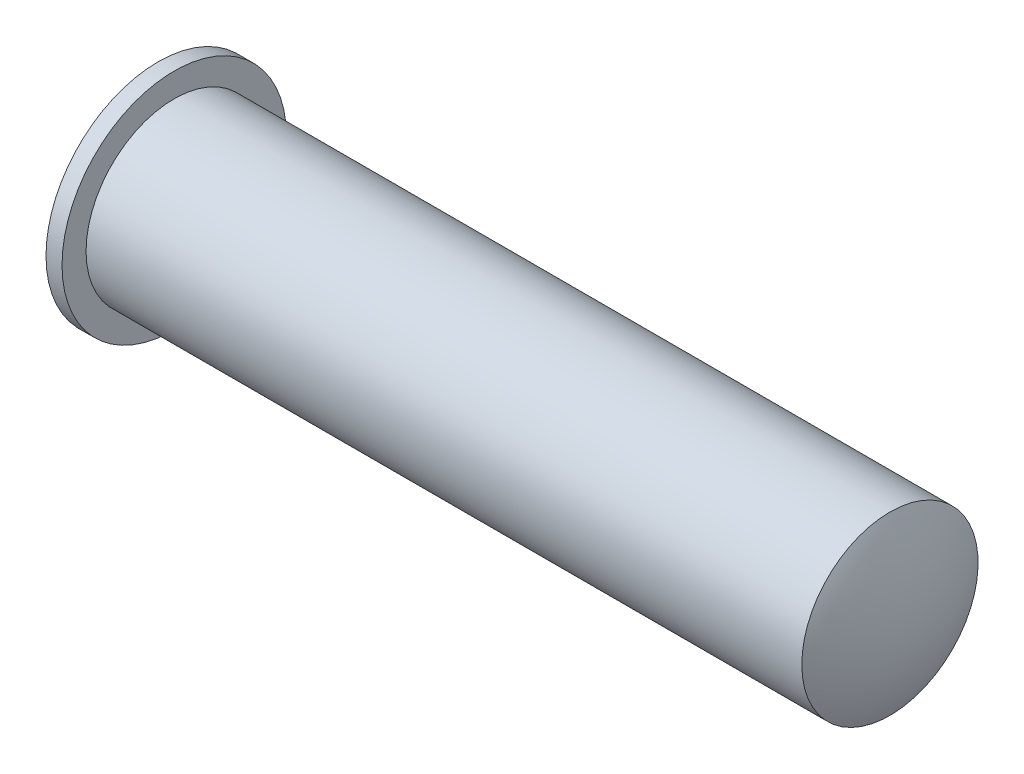
ISO-10303-21;
HEADER;
FILE_DESCRIPTION(('STEP AP214'),'2;1');
FILE_NAME('part.step','',(''),(''),'','','');
FILE_SCHEMA(('AUTOMOTIVE_DESIGN { 1 0 10303 214 1 1 1 1 }'));
ENDSEC;
DATA;
#1=APPLICATION_CONTEXT('core data for automotive mechanical design processes');
#2=APPLICATION_PROTOCOL_DEFINITION('international standard','automotive_design',2000,#1);
#3=PRODUCT_CONTEXT('',#1,'mechanical');
#4=PRODUCT('Part','Part','',(#3));
#5=PRODUCT_RELATED_PRODUCT_CATEGORY('part','',(#4));
#6=PRODUCT_DEFINITION_FORMATION('','',#4);
#7=PRODUCT_DEFINITION_CONTEXT('part definition',#1,'design');
#8=PRODUCT_DEFINITION('design','',#6,#7);
#9=PRODUCT_DEFINITION_SHAPE('','',#8);
#10=(LENGTH_UNIT() NAMED_UNIT(*) SI_UNIT(.MILLI.,.METRE.));
#11=(NAMED_UNIT(*) PLANE_ANGLE_UNIT() SI_UNIT($,.RADIAN.));
#12=(NAMED_UNIT(*) SI_UNIT($,.STERADIAN.) SOLID_ANGLE_UNIT());
#13=UNCERTAINTY_MEASURE_WITH_UNIT(LENGTH_MEASURE(1.E-05),#10,'distance_accuracy_value','');
#14=(GEOMETRIC_REPRESENTATION_CONTEXT(3) GLOBAL_UNCERTAINTY_ASSIGNED_CONTEXT((#13)) GLOBAL_UNIT_ASSIGNED_CONTEXT((#10,
#11,#12)) REPRESENTATION_CONTEXT('',''));
#15=CARTESIAN_POINT('',(0.,0.,0.));
#16=DIRECTION('',(0.,0.,1.));
#17=DIRECTION('',(1.,0.,0.));
#18=AXIS2_PLACEMENT_3D('',#15,#16,#17);
#19=CARTESIAN_POINT('',(11.25,0.,0.));
#20=DIRECTION('',(-1.,0.,0.));
#21=DIRECTION('',(0.,1.,0.));
#22=AXIS2_PLACEMENT_3D('',#19,#20,#21);
#23=SPHERICAL_SURFACE('',#22,13.25);
#24=CARTESIAN_POINT('',(0.,0.,0.));
#25=DIRECTION('',(-1.,0.,0.));
#26=DIRECTION('',(0.,0.,1.));
#27=AXIS2_PLACEMENT_3D('',#24,#25,#26);
#28=CIRCLE('',#27,7.);
#29=CARTESIAN_POINT('',(0.,0.,7.));
#30=VERTEX_POINT('',#29);
#31=EDGE_CURVE('E51',#30,#30,#28,.T.);
#32=ORIENTED_EDGE('',*,*,#31,.T.);
#33=EDGE_LOOP('',(#32));
#34=FACE_BOUND('',#33,.T.);
#35=ADVANCED_FACE('F37',(#34),#23,.T.);
#36=CARTESIAN_POINT('',(35.,0.,0.));
#37=DIRECTION('',(-1.,0.,0.));
#38=DIRECTION('',(0.,1.,0.));
#39=AXIS2_PLACEMENT_3D('',#36,#37,#38);
#40=SPHERICAL_SURFACE('',#39,12.);
#41=CARTESIAN_POINT('',(45.6653645038508,0.,0.));
#42=DIRECTION('',(-1.,0.,0.));
#43=DIRECTION('',(0.,0.,1.));
#44=AXIS2_PLACEMENT_3D('',#41,#42,#43);
#45=CIRCLE('',#44,5.5);
#46=CARTESIAN_POINT('',(45.6653645038508,0.,5.5));
#47=VERTEX_POINT('',#46);
#48=EDGE_CURVE('E10',#47,#47,#45,.T.);
#49=ORIENTED_EDGE('',*,*,#48,.F.);
#50=EDGE_LOOP('',(#49));
#51=FACE_BOUND('',#50,.T.);
#52=ADVANCED_FACE('F71',(#51),#40,.T.);
#53=CARTESIAN_POINT('',(-2.,0.,0.));
#54=DIRECTION('',(-1.,0.,0.));
#55=DIRECTION('',(0.,0.,1.));
#56=AXIS2_PLACEMENT_3D('',#53,#54,#55);
#57=CYLINDRICAL_SURFACE('',#56,5.5);
#58=CARTESIAN_POINT('',(1.,0.,0.));
#59=DIRECTION('',(-1.,0.,0.));
#60=DIRECTION('',(0.,0.,1.));
#61=AXIS2_PLACEMENT_3D('',#58,#59,#60);
#62=CIRCLE('',#61,5.5);
#63=CARTESIAN_POINT('',(1.,0.,5.5));
#64=VERTEX_POINT('',#63);
#65=EDGE_CURVE('E43',#64,#64,#62,.T.);
#66=ORIENTED_EDGE('',*,*,#65,.F.);
#67=EDGE_LOOP('',(#66));
#68=FACE_BOUND('',#67,.T.);
#69=ORIENTED_EDGE('',*,*,#48,.T.);
#70=EDGE_LOOP('',(#69));
#71=FACE_BOUND('',#70,.T.);
#72=ADVANCED_FACE('F66',(#68,#71),#57,.T.);
#73=CARTESIAN_POINT('',(1.,7.,0.));
#74=DIRECTION('',(-1.,0.,0.));
#75=DIRECTION('',(0.,0.,1.));
#76=AXIS2_PLACEMENT_3D('',#73,#74,#75);
#77=PLANE('',#76);
#78=CARTESIAN_POINT('',(1.,0.,0.));
#79=DIRECTION('',(-1.,0.,0.));
#80=DIRECTION('',(0.,0.,1.));
#81=AXIS2_PLACEMENT_3D('',#78,#79,#80);
#82=CIRCLE('',#81,7.);
#83=CARTESIAN_POINT('',(1.,0.,7.));
#84=VERTEX_POINT('',#83);
#85=EDGE_CURVE('E47',#84,#84,#82,.T.);
#86=ORIENTED_EDGE('',*,*,#85,.F.);
#87=EDGE_LOOP('',(#86));
#88=FACE_BOUND('',#87,.T.);
#89=ORIENTED_EDGE('',*,*,#65,.T.);
#90=EDGE_LOOP('',(#89));
#91=FACE_BOUND('',#90,.T.);
#92=ADVANCED_FACE('F61',(#88,#91),#77,.F.);
#93=CARTESIAN_POINT('',(-2.,0.,0.));
#94=DIRECTION('',(-1.,0.,0.));
#95=DIRECTION('',(0.,0.,1.));
#96=AXIS2_PLACEMENT_3D('',#93,#94,#95);
#97=CYLINDRICAL_SURFACE('',#96,7.);
#98=ORIENTED_EDGE('',*,*,#31,.F.);
#99=EDGE_LOOP('',(#98));
#100=FACE_BOUND('',#99,.T.);
#101=ORIENTED_EDGE('',*,*,#85,.T.);
#102=EDGE_LOOP('',(#101));
#103=FACE_BOUND('',#102,.T.);
#104=ADVANCED_FACE('F58',(#100,#103),#97,.T.);
#105=CLOSED_SHELL('',(#35,#52,#72,#92,#104));
#106=MANIFOLD_SOLID_BREP('B2',#105);
#107=ADVANCED_BREP_SHAPE_REPRESENTATION('',(#18,#106),#14);
#108=SHAPE_DEFINITION_REPRESENTATION(#9,#107);
ENDSEC;
END-ISO-10303-21;
